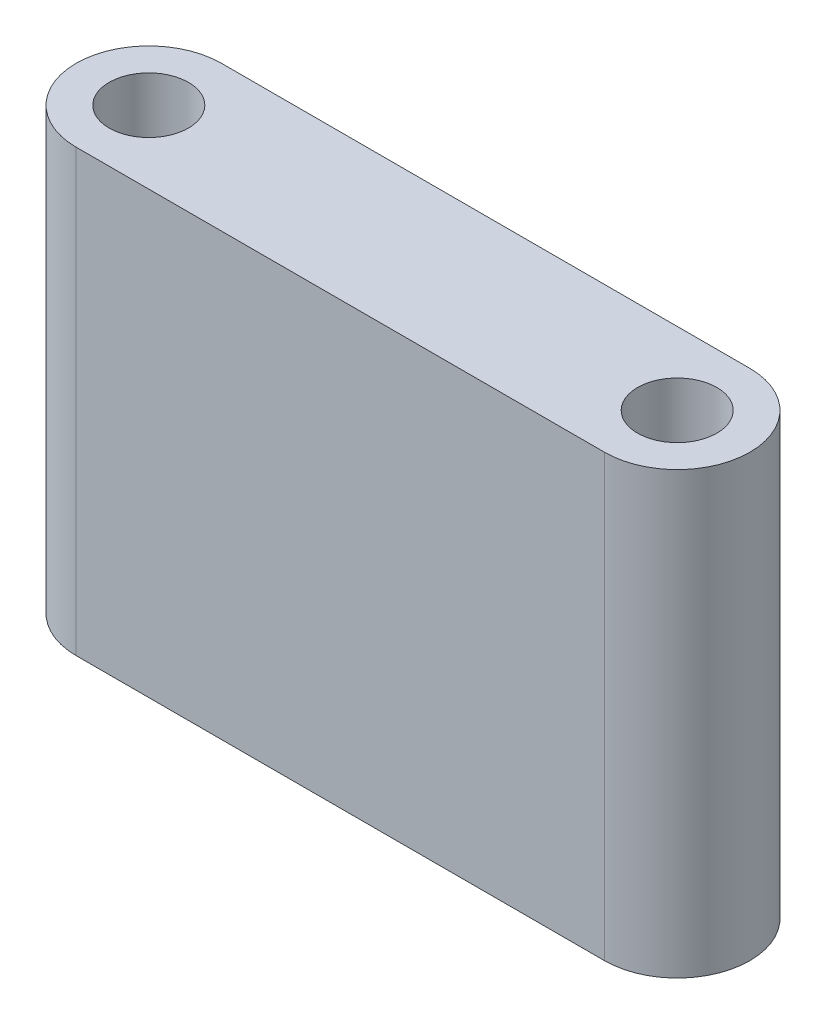
ISO-10303-21;
HEADER;
FILE_DESCRIPTION(('STEP AP214'),'2;1');
FILE_NAME('part.step','',(''),(''),'','','');
FILE_SCHEMA(('AUTOMOTIVE_DESIGN { 1 0 10303 214 1 1 1 1 }'));
ENDSEC;
DATA;
#1=APPLICATION_CONTEXT('core data for automotive mechanical design processes');
#2=APPLICATION_PROTOCOL_DEFINITION('international standard','automotive_design',2000,#1);
#3=PRODUCT_CONTEXT('',#1,'mechanical');
#4=PRODUCT('Part','Part','',(#3));
#5=PRODUCT_RELATED_PRODUCT_CATEGORY('part','',(#4));
#6=PRODUCT_DEFINITION_FORMATION('','',#4);
#7=PRODUCT_DEFINITION_CONTEXT('part definition',#1,'design');
#8=PRODUCT_DEFINITION('design','',#6,#7);
#9=PRODUCT_DEFINITION_SHAPE('','',#8);
#10=(LENGTH_UNIT() NAMED_UNIT(*) SI_UNIT(.MILLI.,.METRE.));
#11=(NAMED_UNIT(*) PLANE_ANGLE_UNIT() SI_UNIT($,.RADIAN.));
#12=(NAMED_UNIT(*) SI_UNIT($,.STERADIAN.) SOLID_ANGLE_UNIT());
#13=UNCERTAINTY_MEASURE_WITH_UNIT(LENGTH_MEASURE(1.E-05),#10,'distance_accuracy_value','');
#14=(GEOMETRIC_REPRESENTATION_CONTEXT(3) GLOBAL_UNCERTAINTY_ASSIGNED_CONTEXT((#13)) GLOBAL_UNIT_ASSIGNED_CONTEXT((#10,
#11,#12)) REPRESENTATION_CONTEXT('',''));
#15=CARTESIAN_POINT('',(0.,0.,0.));
#16=DIRECTION('',(0.,0.,1.));
#17=DIRECTION('',(1.,0.,0.));
#18=AXIS2_PLACEMENT_3D('',#15,#16,#17);
#19=CARTESIAN_POINT('',(0.,20.,0.));
#20=DIRECTION('',(0.,1.,0.));
#21=DIRECTION('',(0.,0.,1.));
#22=AXIS2_PLACEMENT_3D('',#19,#20,#21);
#23=PLANE('',#22);
#24=CARTESIAN_POINT('',(0.,20.,0.));
#25=DIRECTION('',(0.,1.,0.));
#26=DIRECTION('',(0.,0.,1.));
#27=AXIS2_PLACEMENT_3D('',#24,#25,#26);
#28=CIRCLE('',#27,1.8);
#29=CARTESIAN_POINT('',(0.,20.,1.8));
#30=VERTEX_POINT('',#29);
#31=EDGE_CURVE('E108',#30,#30,#28,.T.);
#32=ORIENTED_EDGE('',*,*,#31,.F.);
#33=EDGE_LOOP('',(#32));
#34=FACE_BOUND('',#33,.T.);
#35=CARTESIAN_POINT('',(0.,20.,0.));
#36=DIRECTION('',(0.,1.,0.));
#37=DIRECTION('',(0.,0.,1.));
#38=AXIS2_PLACEMENT_3D('',#35,#36,#37);
#39=CIRCLE('',#38,3.3);
#40=CARTESIAN_POINT('',(0.,20.,-3.3));
#41=VERTEX_POINT('',#40);
#42=CARTESIAN_POINT('',(0.,20.,3.3));
#43=VERTEX_POINT('',#42);
#44=EDGE_CURVE('E93',#41,#43,#39,.T.);
#45=ORIENTED_EDGE('',*,*,#44,.T.);
#46=DIRECTION('',(1.,0.,0.));
#47=VECTOR('',#46,1.);
#48=CARTESIAN_POINT('',(0.,20.,3.3));
#49=LINE('',#48,#47);
#50=CARTESIAN_POINT('',(24.,20.,3.3));
#51=VERTEX_POINT('',#50);
#52=EDGE_CURVE('E88',#43,#51,#49,.T.);
#53=ORIENTED_EDGE('',*,*,#52,.T.);
#54=CARTESIAN_POINT('',(24.,20.,0.));
#55=DIRECTION('',(0.,1.,0.));
#56=DIRECTION('',(0.,0.,1.));
#57=AXIS2_PLACEMENT_3D('',#54,#55,#56);
#58=CIRCLE('',#57,3.3);
#59=CARTESIAN_POINT('',(24.,20.,-3.3));
#60=VERTEX_POINT('',#59);
#61=EDGE_CURVE('E91',#51,#60,#58,.T.);
#62=ORIENTED_EDGE('',*,*,#61,.T.);
#63=DIRECTION('',(-1.,0.,0.));
#64=VECTOR('',#63,1.);
#65=CARTESIAN_POINT('',(0.,20.,-3.3));
#66=LINE('',#65,#64);
#67=EDGE_CURVE('E58',#60,#41,#66,.T.);
#68=ORIENTED_EDGE('',*,*,#67,.T.);
#69=EDGE_LOOP('',(#45,#53,#62,#68));
#70=FACE_BOUND('',#69,.T.);
#71=CARTESIAN_POINT('',(24.,20.,0.));
#72=DIRECTION('',(0.,1.,0.));
#73=DIRECTION('',(0.,0.,-1.));
#74=AXIS2_PLACEMENT_3D('',#71,#72,#73);
#75=CIRCLE('',#74,1.8);
#76=CARTESIAN_POINT('',(24.,20.,-1.8));
#77=VERTEX_POINT('',#76);
#78=EDGE_CURVE('E123',#77,#77,#75,.T.);
#79=ORIENTED_EDGE('',*,*,#78,.F.);
#80=EDGE_LOOP('',(#79));
#81=FACE_BOUND('',#80,.T.);
#82=ADVANCED_FACE('F41',(#34,#70,#81),#23,.T.);
#83=CARTESIAN_POINT('',(0.,0.,0.));
#84=DIRECTION('',(0.,1.,0.));
#85=DIRECTION('',(0.,0.,1.));
#86=AXIS2_PLACEMENT_3D('',#83,#84,#85);
#87=PLANE('',#86);
#88=CARTESIAN_POINT('',(0.,0.,0.));
#89=DIRECTION('',(0.,1.,0.));
#90=DIRECTION('',(0.,0.,1.));
#91=AXIS2_PLACEMENT_3D('',#88,#89,#90);
#92=CIRCLE('',#91,3.3);
#93=CARTESIAN_POINT('',(0.,0.,-3.3));
#94=VERTEX_POINT('',#93);
#95=CARTESIAN_POINT('',(0.,0.,3.3));
#96=VERTEX_POINT('',#95);
#97=EDGE_CURVE('E105',#94,#96,#92,.T.);
#98=ORIENTED_EDGE('',*,*,#97,.F.);
#99=DIRECTION('',(-1.,0.,0.));
#100=VECTOR('',#99,1.);
#101=CARTESIAN_POINT('',(0.,0.,-3.3));
#102=LINE('',#101,#100);
#103=CARTESIAN_POINT('',(24.,0.,-3.3));
#104=VERTEX_POINT('',#103);
#105=EDGE_CURVE('E81',#104,#94,#102,.T.);
#106=ORIENTED_EDGE('',*,*,#105,.F.);
#107=CARTESIAN_POINT('',(24.,0.,0.));
#108=DIRECTION('',(0.,1.,0.));
#109=DIRECTION('',(0.,0.,1.));
#110=AXIS2_PLACEMENT_3D('',#107,#108,#109);
#111=CIRCLE('',#110,3.3);
#112=CARTESIAN_POINT('',(24.,0.,3.3));
#113=VERTEX_POINT('',#112);
#114=EDGE_CURVE('E75',#113,#104,#111,.T.);
#115=ORIENTED_EDGE('',*,*,#114,.F.);
#116=DIRECTION('',(1.,0.,0.));
#117=VECTOR('',#116,1.);
#118=CARTESIAN_POINT('',(0.,0.,3.3));
#119=LINE('',#118,#117);
#120=EDGE_CURVE('E97',#96,#113,#119,.T.);
#121=ORIENTED_EDGE('',*,*,#120,.F.);
#122=EDGE_LOOP('',(#98,#106,#115,#121));
#123=FACE_BOUND('',#122,.T.);
#124=CARTESIAN_POINT('',(0.,0.,0.));
#125=DIRECTION('',(0.,1.,0.));
#126=DIRECTION('',(0.,0.,1.));
#127=AXIS2_PLACEMENT_3D('',#124,#125,#126);
#128=CIRCLE('',#127,1.8);
#129=CARTESIAN_POINT('',(0.,0.,1.8));
#130=VERTEX_POINT('',#129);
#131=EDGE_CURVE('E120',#130,#130,#128,.T.);
#132=ORIENTED_EDGE('',*,*,#131,.T.);
#133=EDGE_LOOP('',(#132));
#134=FACE_BOUND('',#133,.T.);
#135=CARTESIAN_POINT('',(24.,0.,0.));
#136=DIRECTION('',(0.,1.,0.));
#137=DIRECTION('',(0.,0.,-1.));
#138=AXIS2_PLACEMENT_3D('',#135,#136,#137);
#139=CIRCLE('',#138,1.8);
#140=CARTESIAN_POINT('',(24.,0.,-1.8));
#141=VERTEX_POINT('',#140);
#142=EDGE_CURVE('E126',#141,#141,#139,.T.);
#143=ORIENTED_EDGE('',*,*,#142,.T.);
#144=EDGE_LOOP('',(#143));
#145=FACE_BOUND('',#144,.T.);
#146=ADVANCED_FACE('F116',(#123,#134,#145),#87,.F.);
#147=CARTESIAN_POINT('',(0.,20.,0.));
#148=DIRECTION('',(0.,-1.,0.));
#149=DIRECTION('',(0.,0.,-1.));
#150=AXIS2_PLACEMENT_3D('',#147,#148,#149);
#151=CYLINDRICAL_SURFACE('',#150,3.3);
#152=ORIENTED_EDGE('',*,*,#97,.T.);
#153=DIRECTION('',(0.,-1.,0.));
#154=VECTOR('',#153,1.);
#155=CARTESIAN_POINT('',(0.,20.,3.3));
#156=LINE('',#155,#154);
#157=EDGE_CURVE('E11',#43,#96,#156,.T.);
#158=ORIENTED_EDGE('',*,*,#157,.F.);
#159=ORIENTED_EDGE('',*,*,#44,.F.);
#160=DIRECTION('',(0.,-1.,0.));
#161=VECTOR('',#160,1.);
#162=CARTESIAN_POINT('',(0.,20.,-3.3));
#163=LINE('',#162,#161);
#164=EDGE_CURVE('E101',#41,#94,#163,.T.);
#165=ORIENTED_EDGE('',*,*,#164,.T.);
#166=EDGE_LOOP('',(#152,#158,#159,#165));
#167=FACE_BOUND('',#166,.T.);
#168=ADVANCED_FACE('F43',(#167),#151,.T.);
#169=CARTESIAN_POINT('',(0.,20.,3.3));
#170=DIRECTION('',(0.,0.,-1.));
#171=DIRECTION('',(-1.,0.,0.));
#172=AXIS2_PLACEMENT_3D('',#169,#170,#171);
#173=PLANE('',#172);
#174=ORIENTED_EDGE('',*,*,#120,.T.);
#175=DIRECTION('',(0.,-1.,0.));
#176=VECTOR('',#175,1.);
#177=CARTESIAN_POINT('',(24.,20.,3.3));
#178=LINE('',#177,#176);
#179=EDGE_CURVE('E50',#51,#113,#178,.T.);
#180=ORIENTED_EDGE('',*,*,#179,.F.);
#181=ORIENTED_EDGE('',*,*,#52,.F.);
#182=ORIENTED_EDGE('',*,*,#157,.T.);
#183=EDGE_LOOP('',(#174,#180,#181,#182));
#184=FACE_BOUND('',#183,.T.);
#185=ADVANCED_FACE('F96',(#184),#173,.F.);
#186=CARTESIAN_POINT('',(24.,20.,0.));
#187=DIRECTION('',(0.,-1.,0.));
#188=DIRECTION('',(0.,0.,-1.));
#189=AXIS2_PLACEMENT_3D('',#186,#187,#188);
#190=CYLINDRICAL_SURFACE('',#189,3.3);
#191=ORIENTED_EDGE('',*,*,#114,.T.);
#192=DIRECTION('',(0.,-1.,0.));
#193=VECTOR('',#192,1.);
#194=CARTESIAN_POINT('',(24.,20.,-3.3));
#195=LINE('',#194,#193);
#196=EDGE_CURVE('E98',#60,#104,#195,.T.);
#197=ORIENTED_EDGE('',*,*,#196,.F.);
#198=ORIENTED_EDGE('',*,*,#61,.F.);
#199=ORIENTED_EDGE('',*,*,#179,.T.);
#200=EDGE_LOOP('',(#191,#197,#198,#199));
#201=FACE_BOUND('',#200,.T.);
#202=ADVANCED_FACE('F99',(#201),#190,.T.);
#203=CARTESIAN_POINT('',(0.,20.,-3.3));
#204=DIRECTION('',(0.,0.,1.));
#205=DIRECTION('',(1.,0.,0.));
#206=AXIS2_PLACEMENT_3D('',#203,#204,#205);
#207=PLANE('',#206);
#208=ORIENTED_EDGE('',*,*,#105,.T.);
#209=ORIENTED_EDGE('',*,*,#164,.F.);
#210=ORIENTED_EDGE('',*,*,#67,.F.);
#211=ORIENTED_EDGE('',*,*,#196,.T.);
#212=EDGE_LOOP('',(#208,#209,#210,#211));
#213=FACE_BOUND('',#212,.T.);
#214=ADVANCED_FACE('F113',(#213),#207,.F.);
#215=CARTESIAN_POINT('',(0.,20.,0.));
#216=DIRECTION('',(0.,-1.,0.));
#217=DIRECTION('',(0.,0.,-1.));
#218=AXIS2_PLACEMENT_3D('',#215,#216,#217);
#219=CYLINDRICAL_SURFACE('',#218,1.8);
#220=ORIENTED_EDGE('',*,*,#31,.T.);
#221=EDGE_LOOP('',(#220));
#222=FACE_BOUND('',#221,.T.);
#223=ORIENTED_EDGE('',*,*,#131,.F.);
#224=EDGE_LOOP('',(#223));
#225=FACE_BOUND('',#224,.T.);
#226=ADVANCED_FACE('F143',(#222,#225),#219,.F.);
#227=CARTESIAN_POINT('',(24.,20.,0.));
#228=DIRECTION('',(0.,-1.,0.));
#229=DIRECTION('',(0.,0.,-1.));
#230=AXIS2_PLACEMENT_3D('',#227,#228,#229);
#231=CYLINDRICAL_SURFACE('',#230,1.8);
#232=ORIENTED_EDGE('',*,*,#78,.T.);
#233=EDGE_LOOP('',(#232));
#234=FACE_BOUND('',#233,.T.);
#235=ORIENTED_EDGE('',*,*,#142,.F.);
#236=EDGE_LOOP('',(#235));
#237=FACE_BOUND('',#236,.T.);
#238=ADVANCED_FACE('F132',(#234,#237),#231,.F.);
#239=CLOSED_SHELL('',(#82,#146,#168,#185,#202,#214,#226,#238));
#240=MANIFOLD_SOLID_BREP('B2',#239);
#241=ADVANCED_BREP_SHAPE_REPRESENTATION('',(#18,#240),#14);
#242=SHAPE_DEFINITION_REPRESENTATION(#9,#241);
ENDSEC;
END-ISO-10303-21;
